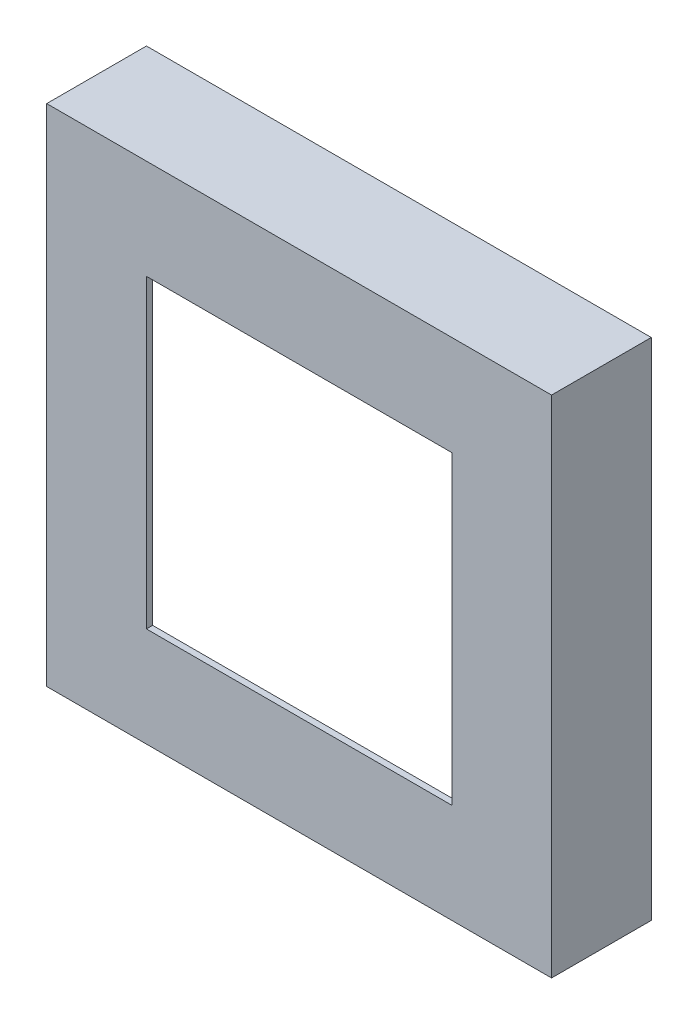
ISO-10303-21;
HEADER;
FILE_DESCRIPTION(('STEP AP214'),'2;1');
FILE_NAME('part.step','',(''),(''),'','','');
FILE_SCHEMA(('AUTOMOTIVE_DESIGN { 1 0 10303 214 1 1 1 1 }'));
ENDSEC;
DATA;
#1=APPLICATION_CONTEXT('core data for automotive mechanical design processes');
#2=APPLICATION_PROTOCOL_DEFINITION('international standard','automotive_design',2000,#1);
#3=PRODUCT_CONTEXT('',#1,'mechanical');
#4=PRODUCT('Part','Part','',(#3));
#5=PRODUCT_RELATED_PRODUCT_CATEGORY('part','',(#4));
#6=PRODUCT_DEFINITION_FORMATION('','',#4);
#7=PRODUCT_DEFINITION_CONTEXT('part definition',#1,'design');
#8=PRODUCT_DEFINITION('design','',#6,#7);
#9=PRODUCT_DEFINITION_SHAPE('','',#8);
#10=(LENGTH_UNIT() NAMED_UNIT(*) SI_UNIT(.MILLI.,.METRE.));
#11=(NAMED_UNIT(*) PLANE_ANGLE_UNIT() SI_UNIT($,.RADIAN.));
#12=(NAMED_UNIT(*) SI_UNIT($,.STERADIAN.) SOLID_ANGLE_UNIT());
#13=UNCERTAINTY_MEASURE_WITH_UNIT(LENGTH_MEASURE(1.E-05),#10,'distance_accuracy_value','');
#14=(GEOMETRIC_REPRESENTATION_CONTEXT(3) GLOBAL_UNCERTAINTY_ASSIGNED_CONTEXT((#13)) GLOBAL_UNIT_ASSIGNED_CONTEXT((#10,
#11,#12)) REPRESENTATION_CONTEXT('',''));
#15=CARTESIAN_POINT('',(0.,0.,0.));
#16=DIRECTION('',(0.,0.,1.));
#17=DIRECTION('',(1.,0.,0.));
#18=AXIS2_PLACEMENT_3D('',#15,#16,#17);
#19=CARTESIAN_POINT('',(0.,0.,0.));
#20=DIRECTION('',(0.,0.,1.));
#21=DIRECTION('',(1.,0.,0.));
#22=AXIS2_PLACEMENT_3D('',#19,#20,#21);
#23=PLANE('',#22);
#24=DIRECTION('',(1.,0.,0.));
#25=VECTOR('',#24,1.);
#26=CARTESIAN_POINT('',(-1.,-1.,0.));
#27=LINE('',#26,#25);
#28=CARTESIAN_POINT('',(-1.,-1.,0.));
#29=VERTEX_POINT('',#28);
#30=CARTESIAN_POINT('',(80.,-1.,0.));
#31=VERTEX_POINT('',#30);
#32=EDGE_CURVE('E241',#29,#31,#27,.T.);
#33=ORIENTED_EDGE('',*,*,#32,.F.);
#34=DIRECTION('',(0.,-1.,0.));
#35=VECTOR('',#34,1.);
#36=CARTESIAN_POINT('',(-1.,-1.,0.));
#37=LINE('',#36,#35);
#38=CARTESIAN_POINT('',(-1.,80.,0.));
#39=VERTEX_POINT('',#38);
#40=EDGE_CURVE('E251',#39,#29,#37,.T.);
#41=ORIENTED_EDGE('',*,*,#40,.F.);
#42=DIRECTION('',(-1.,0.,0.));
#43=VECTOR('',#42,1.);
#44=CARTESIAN_POINT('',(-1.,80.,0.));
#45=LINE('',#44,#43);
#46=CARTESIAN_POINT('',(80.,80.,0.));
#47=VERTEX_POINT('',#46);
#48=EDGE_CURVE('E248',#47,#39,#45,.T.);
#49=ORIENTED_EDGE('',*,*,#48,.F.);
#50=DIRECTION('',(0.,1.,0.));
#51=VECTOR('',#50,1.);
#52=CARTESIAN_POINT('',(80.,-1.,0.));
#53=LINE('',#52,#51);
#54=EDGE_CURVE('E245',#31,#47,#53,.T.);
#55=ORIENTED_EDGE('',*,*,#54,.F.);
#56=EDGE_LOOP('',(#33,#41,#49,#55));
#57=FACE_BOUND('',#56,.T.);
#58=DIRECTION('',(0.,-1.,0.));
#59=VECTOR('',#58,1.);
#60=CARTESIAN_POINT('',(0.,0.,0.));
#61=LINE('',#60,#59);
#62=CARTESIAN_POINT('',(0.,79.,0.));
#63=VERTEX_POINT('',#62);
#64=CARTESIAN_POINT('',(0.,0.,0.));
#65=VERTEX_POINT('',#64);
#66=EDGE_CURVE('E63',#63,#65,#61,.T.);
#67=ORIENTED_EDGE('',*,*,#66,.T.);
#68=DIRECTION('',(1.,0.,0.));
#69=VECTOR('',#68,1.);
#70=CARTESIAN_POINT('',(0.,0.,0.));
#71=LINE('',#70,#69);
#72=CARTESIAN_POINT('',(79.,0.,0.));
#73=VERTEX_POINT('',#72);
#74=EDGE_CURVE('E219',#65,#73,#71,.T.);
#75=ORIENTED_EDGE('',*,*,#74,.T.);
#76=DIRECTION('',(0.,1.,0.));
#77=VECTOR('',#76,1.);
#78=CARTESIAN_POINT('',(79.,0.,0.));
#79=LINE('',#78,#77);
#80=CARTESIAN_POINT('',(79.,79.,0.));
#81=VERTEX_POINT('',#80);
#82=EDGE_CURVE('E223',#73,#81,#79,.T.);
#83=ORIENTED_EDGE('',*,*,#82,.T.);
#84=DIRECTION('',(-1.,0.,0.));
#85=VECTOR('',#84,1.);
#86=CARTESIAN_POINT('',(0.,79.,0.));
#87=LINE('',#86,#85);
#88=EDGE_CURVE('E206',#81,#63,#87,.T.);
#89=ORIENTED_EDGE('',*,*,#88,.T.);
#90=EDGE_LOOP('',(#67,#75,#83,#89));
#91=FACE_BOUND('',#90,.T.);
#92=ADVANCED_FACE('F39',(#57,#91),#23,.F.);
#93=CARTESIAN_POINT('',(-1.,-1.,15.));
#94=DIRECTION('',(0.,1.,0.));
#95=DIRECTION('',(0.,0.,1.));
#96=AXIS2_PLACEMENT_3D('',#93,#94,#95);
#97=PLANE('',#96);
#98=ORIENTED_EDGE('',*,*,#32,.T.);
#99=DIRECTION('',(0.,0.,-1.));
#100=VECTOR('',#99,1.);
#101=CARTESIAN_POINT('',(80.,-1.,15.));
#102=LINE('',#101,#100);
#103=CARTESIAN_POINT('',(80.,-1.,16.));
#104=VERTEX_POINT('',#103);
#105=EDGE_CURVE('E11',#104,#31,#102,.T.);
#106=ORIENTED_EDGE('',*,*,#105,.F.);
#107=DIRECTION('',(1.,0.,0.));
#108=VECTOR('',#107,1.);
#109=CARTESIAN_POINT('',(-1.,-1.,16.));
#110=LINE('',#109,#108);
#111=CARTESIAN_POINT('',(-1.,-1.,16.));
#112=VERTEX_POINT('',#111);
#113=EDGE_CURVE('E189',#112,#104,#110,.T.);
#114=ORIENTED_EDGE('',*,*,#113,.F.);
#115=DIRECTION('',(0.,0.,-1.));
#116=VECTOR('',#115,1.);
#117=CARTESIAN_POINT('',(-1.,-1.,15.));
#118=LINE('',#117,#116);
#119=EDGE_CURVE('E254',#112,#29,#118,.T.);
#120=ORIENTED_EDGE('',*,*,#119,.T.);
#121=EDGE_LOOP('',(#98,#106,#114,#120));
#122=FACE_BOUND('',#121,.T.);
#123=ADVANCED_FACE('F41',(#122),#97,.F.);
#124=CARTESIAN_POINT('',(80.,-1.,15.));
#125=DIRECTION('',(-1.,0.,0.));
#126=DIRECTION('',(0.,-1.,0.));
#127=AXIS2_PLACEMENT_3D('',#124,#125,#126);
#128=PLANE('',#127);
#129=ORIENTED_EDGE('',*,*,#54,.T.);
#130=DIRECTION('',(0.,0.,-1.));
#131=VECTOR('',#130,1.);
#132=CARTESIAN_POINT('',(80.,80.,15.));
#133=LINE('',#132,#131);
#134=CARTESIAN_POINT('',(80.,80.,16.));
#135=VERTEX_POINT('',#134);
#136=EDGE_CURVE('E48',#135,#47,#133,.T.);
#137=ORIENTED_EDGE('',*,*,#136,.F.);
#138=DIRECTION('',(0.,1.,0.));
#139=VECTOR('',#138,1.);
#140=CARTESIAN_POINT('',(80.,80.,16.));
#141=LINE('',#140,#139);
#142=EDGE_CURVE('E193',#104,#135,#141,.T.);
#143=ORIENTED_EDGE('',*,*,#142,.F.);
#144=ORIENTED_EDGE('',*,*,#105,.T.);
#145=EDGE_LOOP('',(#129,#137,#143,#144));
#146=FACE_BOUND('',#145,.T.);
#147=ADVANCED_FACE('F279',(#146),#128,.F.);
#148=CARTESIAN_POINT('',(-1.,80.,15.));
#149=DIRECTION('',(0.,-1.,0.));
#150=DIRECTION('',(0.,0.,-1.));
#151=AXIS2_PLACEMENT_3D('',#148,#149,#150);
#152=PLANE('',#151);
#153=ORIENTED_EDGE('',*,*,#48,.T.);
#154=DIRECTION('',(0.,0.,-1.));
#155=VECTOR('',#154,1.);
#156=CARTESIAN_POINT('',(-1.,80.,15.));
#157=LINE('',#156,#155);
#158=CARTESIAN_POINT('',(-1.,80.,16.));
#159=VERTEX_POINT('',#158);
#160=EDGE_CURVE('E258',#159,#39,#157,.T.);
#161=ORIENTED_EDGE('',*,*,#160,.F.);
#162=DIRECTION('',(-1.,0.,0.));
#163=VECTOR('',#162,1.);
#164=CARTESIAN_POINT('',(-1.,80.,16.));
#165=LINE('',#164,#163);
#166=EDGE_CURVE('E197',#135,#159,#165,.T.);
#167=ORIENTED_EDGE('',*,*,#166,.F.);
#168=ORIENTED_EDGE('',*,*,#136,.T.);
#169=EDGE_LOOP('',(#153,#161,#167,#168));
#170=FACE_BOUND('',#169,.T.);
#171=ADVANCED_FACE('F266',(#170),#152,.F.);
#172=CARTESIAN_POINT('',(-1.,-1.,15.));
#173=DIRECTION('',(1.,0.,0.));
#174=DIRECTION('',(0.,0.,-1.));
#175=AXIS2_PLACEMENT_3D('',#172,#173,#174);
#176=PLANE('',#175);
#177=ORIENTED_EDGE('',*,*,#40,.T.);
#178=ORIENTED_EDGE('',*,*,#119,.F.);
#179=DIRECTION('',(0.,-1.,0.));
#180=VECTOR('',#179,1.);
#181=CARTESIAN_POINT('',(-1.,80.,16.));
#182=LINE('',#181,#180);
#183=EDGE_CURVE('E152',#159,#112,#182,.T.);
#184=ORIENTED_EDGE('',*,*,#183,.F.);
#185=ORIENTED_EDGE('',*,*,#160,.T.);
#186=EDGE_LOOP('',(#177,#178,#184,#185));
#187=FACE_BOUND('',#186,.T.);
#188=ADVANCED_FACE('F274',(#187),#176,.F.);
#189=CARTESIAN_POINT('',(0.,0.,15.));
#190=DIRECTION('',(1.,0.,0.));
#191=DIRECTION('',(0.,1.,0.));
#192=AXIS2_PLACEMENT_3D('',#189,#190,#191);
#193=PLANE('',#192);
#194=ORIENTED_EDGE('',*,*,#66,.F.);
#195=DIRECTION('',(0.,0.,-1.));
#196=VECTOR('',#195,1.);
#197=CARTESIAN_POINT('',(0.,79.,15.));
#198=LINE('',#197,#196);
#199=CARTESIAN_POINT('',(0.,79.,15.));
#200=VERTEX_POINT('',#199);
#201=EDGE_CURVE('E216',#200,#63,#198,.T.);
#202=ORIENTED_EDGE('',*,*,#201,.F.);
#203=DIRECTION('',(0.,-1.,0.));
#204=VECTOR('',#203,1.);
#205=CARTESIAN_POINT('',(0.,0.,15.));
#206=LINE('',#205,#204);
#207=CARTESIAN_POINT('',(0.,0.,15.));
#208=VERTEX_POINT('',#207);
#209=EDGE_CURVE('E201',#200,#208,#206,.T.);
#210=ORIENTED_EDGE('',*,*,#209,.T.);
#211=DIRECTION('',(0.,0.,-1.));
#212=VECTOR('',#211,1.);
#213=CARTESIAN_POINT('',(0.,0.,15.));
#214=LINE('',#213,#212);
#215=EDGE_CURVE('E238',#208,#65,#214,.T.);
#216=ORIENTED_EDGE('',*,*,#215,.T.);
#217=EDGE_LOOP('',(#194,#202,#210,#216));
#218=FACE_BOUND('',#217,.T.);
#219=ADVANCED_FACE('F292',(#218),#193,.T.);
#220=CARTESIAN_POINT('',(0.,0.,15.));
#221=DIRECTION('',(0.,1.,0.));
#222=DIRECTION('',(0.,0.,1.));
#223=AXIS2_PLACEMENT_3D('',#220,#221,#222);
#224=PLANE('',#223);
#225=ORIENTED_EDGE('',*,*,#74,.F.);
#226=ORIENTED_EDGE('',*,*,#215,.F.);
#227=DIRECTION('',(1.,0.,0.));
#228=VECTOR('',#227,1.);
#229=CARTESIAN_POINT('',(0.,0.,15.));
#230=LINE('',#229,#228);
#231=CARTESIAN_POINT('',(79.,0.,15.));
#232=VERTEX_POINT('',#231);
#233=EDGE_CURVE('E205',#208,#232,#230,.T.);
#234=ORIENTED_EDGE('',*,*,#233,.T.);
#235=DIRECTION('',(0.,0.,-1.));
#236=VECTOR('',#235,1.);
#237=CARTESIAN_POINT('',(79.,0.,15.));
#238=LINE('',#237,#236);
#239=EDGE_CURVE('E235',#232,#73,#238,.T.);
#240=ORIENTED_EDGE('',*,*,#239,.T.);
#241=EDGE_LOOP('',(#225,#226,#234,#240));
#242=FACE_BOUND('',#241,.T.);
#243=ADVANCED_FACE('F298',(#242),#224,.T.);
#244=CARTESIAN_POINT('',(79.,0.,15.));
#245=DIRECTION('',(-1.,0.,0.));
#246=DIRECTION('',(0.,-1.,0.));
#247=AXIS2_PLACEMENT_3D('',#244,#245,#246);
#248=PLANE('',#247);
#249=ORIENTED_EDGE('',*,*,#82,.F.);
#250=ORIENTED_EDGE('',*,*,#239,.F.);
#251=DIRECTION('',(0.,1.,0.));
#252=VECTOR('',#251,1.);
#253=CARTESIAN_POINT('',(79.,0.,15.));
#254=LINE('',#253,#252);
#255=CARTESIAN_POINT('',(79.,79.,15.));
#256=VERTEX_POINT('',#255);
#257=EDGE_CURVE('E210',#232,#256,#254,.T.);
#258=ORIENTED_EDGE('',*,*,#257,.T.);
#259=DIRECTION('',(0.,0.,-1.));
#260=VECTOR('',#259,1.);
#261=CARTESIAN_POINT('',(79.,79.,15.));
#262=LINE('',#261,#260);
#263=EDGE_CURVE('E232',#256,#81,#262,.T.);
#264=ORIENTED_EDGE('',*,*,#263,.T.);
#265=EDGE_LOOP('',(#249,#250,#258,#264));
#266=FACE_BOUND('',#265,.T.);
#267=ADVANCED_FACE('F302',(#266),#248,.T.);
#268=CARTESIAN_POINT('',(0.,79.,15.));
#269=DIRECTION('',(0.,-1.,0.));
#270=DIRECTION('',(0.,0.,-1.));
#271=AXIS2_PLACEMENT_3D('',#268,#269,#270);
#272=PLANE('',#271);
#273=ORIENTED_EDGE('',*,*,#88,.F.);
#274=ORIENTED_EDGE('',*,*,#263,.F.);
#275=DIRECTION('',(-1.,0.,0.));
#276=VECTOR('',#275,1.);
#277=CARTESIAN_POINT('',(0.,79.,15.));
#278=LINE('',#277,#276);
#279=EDGE_CURVE('E55',#256,#200,#278,.T.);
#280=ORIENTED_EDGE('',*,*,#279,.T.);
#281=ORIENTED_EDGE('',*,*,#201,.T.);
#282=EDGE_LOOP('',(#273,#274,#280,#281));
#283=FACE_BOUND('',#282,.T.);
#284=ADVANCED_FACE('F307',(#283),#272,.T.);
#285=CARTESIAN_POINT('',(0.,0.,16.));
#286=DIRECTION('',(0.,0.,1.));
#287=DIRECTION('',(1.,0.,0.));
#288=AXIS2_PLACEMENT_3D('',#285,#286,#287);
#289=PLANE('',#288);
#290=ORIENTED_EDGE('',*,*,#183,.T.);
#291=ORIENTED_EDGE('',*,*,#113,.T.);
#292=ORIENTED_EDGE('',*,*,#142,.T.);
#293=ORIENTED_EDGE('',*,*,#166,.T.);
#294=EDGE_LOOP('',(#290,#291,#292,#293));
#295=FACE_BOUND('',#294,.T.);
#296=DIRECTION('',(1.,0.,0.));
#297=VECTOR('',#296,1.);
#298=CARTESIAN_POINT('',(64.,15.,16.));
#299=LINE('',#298,#297);
#300=CARTESIAN_POINT('',(15.,15.,16.));
#301=VERTEX_POINT('',#300);
#302=CARTESIAN_POINT('',(64.,15.,16.));
#303=VERTEX_POINT('',#302);
#304=EDGE_CURVE('E143',#301,#303,#299,.T.);
#305=ORIENTED_EDGE('',*,*,#304,.F.);
#306=DIRECTION('',(0.,-1.,0.));
#307=VECTOR('',#306,1.);
#308=CARTESIAN_POINT('',(15.,15.,16.));
#309=LINE('',#308,#307);
#310=CARTESIAN_POINT('',(15.,64.,16.));
#311=VERTEX_POINT('',#310);
#312=EDGE_CURVE('E132',#311,#301,#309,.T.);
#313=ORIENTED_EDGE('',*,*,#312,.F.);
#314=DIRECTION('',(-1.,0.,0.));
#315=VECTOR('',#314,1.);
#316=CARTESIAN_POINT('',(64.,64.,16.));
#317=LINE('',#316,#315);
#318=CARTESIAN_POINT('',(64.,64.,16.));
#319=VERTEX_POINT('',#318);
#320=EDGE_CURVE('E162',#319,#311,#317,.T.);
#321=ORIENTED_EDGE('',*,*,#320,.F.);
#322=DIRECTION('',(0.,1.,0.));
#323=VECTOR('',#322,1.);
#324=CARTESIAN_POINT('',(64.,15.,16.));
#325=LINE('',#324,#323);
#326=EDGE_CURVE('E158',#303,#319,#325,.T.);
#327=ORIENTED_EDGE('',*,*,#326,.F.);
#328=EDGE_LOOP('',(#305,#313,#321,#327));
#329=FACE_BOUND('',#328,.T.);
#330=ADVANCED_FACE('F156',(#295,#329),#289,.T.);
#331=CARTESIAN_POINT('',(0.,0.,15.));
#332=DIRECTION('',(0.,0.,1.));
#333=DIRECTION('',(1.,0.,0.));
#334=AXIS2_PLACEMENT_3D('',#331,#332,#333);
#335=PLANE('',#334);
#336=ORIENTED_EDGE('',*,*,#233,.F.);
#337=ORIENTED_EDGE('',*,*,#209,.F.);
#338=ORIENTED_EDGE('',*,*,#279,.F.);
#339=ORIENTED_EDGE('',*,*,#257,.F.);
#340=EDGE_LOOP('',(#336,#337,#338,#339));
#341=FACE_BOUND('',#340,.T.);
#342=DIRECTION('',(0.,-1.,0.));
#343=VECTOR('',#342,1.);
#344=CARTESIAN_POINT('',(15.,15.,15.));
#345=LINE('',#344,#343);
#346=CARTESIAN_POINT('',(15.,64.,15.));
#347=VERTEX_POINT('',#346);
#348=CARTESIAN_POINT('',(15.,15.,15.));
#349=VERTEX_POINT('',#348);
#350=EDGE_CURVE('E167',#347,#349,#345,.T.);
#351=ORIENTED_EDGE('',*,*,#350,.T.);
#352=DIRECTION('',(1.,0.,0.));
#353=VECTOR('',#352,1.);
#354=CARTESIAN_POINT('',(64.,15.,15.));
#355=LINE('',#354,#353);
#356=CARTESIAN_POINT('',(64.,15.,15.));
#357=VERTEX_POINT('',#356);
#358=EDGE_CURVE('E150',#349,#357,#355,.T.);
#359=ORIENTED_EDGE('',*,*,#358,.T.);
#360=DIRECTION('',(0.,1.,0.));
#361=VECTOR('',#360,1.);
#362=CARTESIAN_POINT('',(64.,15.,15.));
#363=LINE('',#362,#361);
#364=CARTESIAN_POINT('',(64.,64.,15.));
#365=VERTEX_POINT('',#364);
#366=EDGE_CURVE('E172',#357,#365,#363,.T.);
#367=ORIENTED_EDGE('',*,*,#366,.T.);
#368=DIRECTION('',(-1.,0.,0.));
#369=VECTOR('',#368,1.);
#370=CARTESIAN_POINT('',(64.,64.,15.));
#371=LINE('',#370,#369);
#372=EDGE_CURVE('E144',#365,#347,#371,.T.);
#373=ORIENTED_EDGE('',*,*,#372,.T.);
#374=EDGE_LOOP('',(#351,#359,#367,#373));
#375=FACE_BOUND('',#374,.T.);
#376=ADVANCED_FACE('F314',(#341,#375),#335,.F.);
#377=CARTESIAN_POINT('',(15.,15.,16.));
#378=DIRECTION('',(1.,0.,0.));
#379=DIRECTION('',(0.,1.,0.));
#380=AXIS2_PLACEMENT_3D('',#377,#378,#379);
#381=PLANE('',#380);
#382=ORIENTED_EDGE('',*,*,#350,.F.);
#383=DIRECTION('',(0.,0.,-1.));
#384=VECTOR('',#383,1.);
#385=CARTESIAN_POINT('',(15.,64.,16.));
#386=LINE('',#385,#384);
#387=EDGE_CURVE('E138',#311,#347,#386,.T.);
#388=ORIENTED_EDGE('',*,*,#387,.F.);
#389=ORIENTED_EDGE('',*,*,#312,.T.);
#390=DIRECTION('',(0.,0.,-1.));
#391=VECTOR('',#390,1.);
#392=CARTESIAN_POINT('',(15.,15.,16.));
#393=LINE('',#392,#391);
#394=EDGE_CURVE('E135',#301,#349,#393,.T.);
#395=ORIENTED_EDGE('',*,*,#394,.T.);
#396=EDGE_LOOP('',(#382,#388,#389,#395));
#397=FACE_BOUND('',#396,.T.);
#398=ADVANCED_FACE('F134',(#397),#381,.T.);
#399=CARTESIAN_POINT('',(64.,15.,16.));
#400=DIRECTION('',(0.,1.,0.));
#401=DIRECTION('',(-1.,0.,0.));
#402=AXIS2_PLACEMENT_3D('',#399,#400,#401);
#403=PLANE('',#402);
#404=ORIENTED_EDGE('',*,*,#358,.F.);
#405=ORIENTED_EDGE('',*,*,#394,.F.);
#406=ORIENTED_EDGE('',*,*,#304,.T.);
#407=DIRECTION('',(0.,0.,-1.));
#408=VECTOR('',#407,1.);
#409=CARTESIAN_POINT('',(64.,15.,16.));
#410=LINE('',#409,#408);
#411=EDGE_CURVE('E153',#303,#357,#410,.T.);
#412=ORIENTED_EDGE('',*,*,#411,.T.);
#413=EDGE_LOOP('',(#404,#405,#406,#412));
#414=FACE_BOUND('',#413,.T.);
#415=ADVANCED_FACE('F147',(#414),#403,.T.);
#416=CARTESIAN_POINT('',(64.,15.,16.));
#417=DIRECTION('',(-1.,0.,0.));
#418=DIRECTION('',(0.,0.,1.));
#419=AXIS2_PLACEMENT_3D('',#416,#417,#418);
#420=PLANE('',#419);
#421=ORIENTED_EDGE('',*,*,#366,.F.);
#422=ORIENTED_EDGE('',*,*,#411,.F.);
#423=ORIENTED_EDGE('',*,*,#326,.T.);
#424=DIRECTION('',(0.,0.,-1.));
#425=VECTOR('',#424,1.);
#426=CARTESIAN_POINT('',(64.,64.,16.));
#427=LINE('',#426,#425);
#428=EDGE_CURVE('E181',#319,#365,#427,.T.);
#429=ORIENTED_EDGE('',*,*,#428,.T.);
#430=EDGE_LOOP('',(#421,#422,#423,#429));
#431=FACE_BOUND('',#430,.T.);
#432=ADVANCED_FACE('F323',(#431),#420,.T.);
#433=CARTESIAN_POINT('',(64.,64.,16.));
#434=DIRECTION('',(0.,-1.,0.));
#435=DIRECTION('',(0.,0.,-1.));
#436=AXIS2_PLACEMENT_3D('',#433,#434,#435);
#437=PLANE('',#436);
#438=ORIENTED_EDGE('',*,*,#372,.F.);
#439=ORIENTED_EDGE('',*,*,#428,.F.);
#440=ORIENTED_EDGE('',*,*,#320,.T.);
#441=ORIENTED_EDGE('',*,*,#387,.T.);
#442=EDGE_LOOP('',(#438,#439,#440,#441));
#443=FACE_BOUND('',#442,.T.);
#444=ADVANCED_FACE('F326',(#443),#437,.T.);
#445=CLOSED_SHELL('',(#92,#123,#147,#171,#188,#219,#243,#267,#284,#330,#376,#398,#415,#432,#444));
#446=MANIFOLD_SOLID_BREP('B2',#445);
#447=ADVANCED_BREP_SHAPE_REPRESENTATION('',(#18,#446),#14);
#448=SHAPE_DEFINITION_REPRESENTATION(#9,#447);
ENDSEC;
END-ISO-10303-21;
